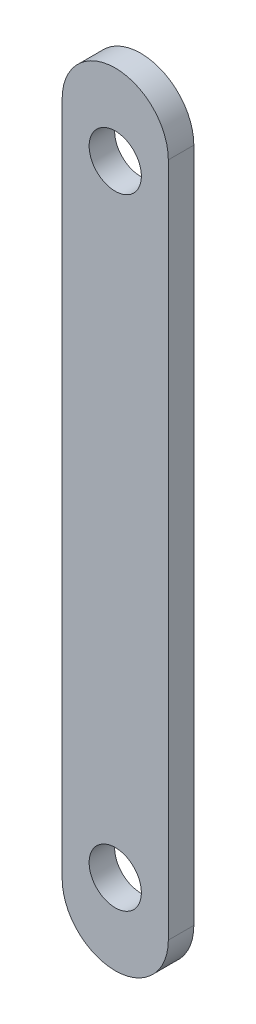
ISO-10303-21;
HEADER;
FILE_DESCRIPTION(('STEP AP214'),'2;1');
FILE_NAME('part.step','',(''),(''),'','','');
FILE_SCHEMA(('AUTOMOTIVE_DESIGN { 1 0 10303 214 1 1 1 1 }'));
ENDSEC;
DATA;
#1=APPLICATION_CONTEXT('core data for automotive mechanical design processes');
#2=APPLICATION_PROTOCOL_DEFINITION('international standard','automotive_design',2000,#1);
#3=PRODUCT_CONTEXT('',#1,'mechanical');
#4=PRODUCT('Part','Part','',(#3));
#5=PRODUCT_RELATED_PRODUCT_CATEGORY('part','',(#4));
#6=PRODUCT_DEFINITION_FORMATION('','',#4);
#7=PRODUCT_DEFINITION_CONTEXT('part definition',#1,'design');
#8=PRODUCT_DEFINITION('design','',#6,#7);
#9=PRODUCT_DEFINITION_SHAPE('','',#8);
#10=(LENGTH_UNIT() NAMED_UNIT(*) SI_UNIT(.MILLI.,.METRE.));
#11=(NAMED_UNIT(*) PLANE_ANGLE_UNIT() SI_UNIT($,.RADIAN.));
#12=(NAMED_UNIT(*) SI_UNIT($,.STERADIAN.) SOLID_ANGLE_UNIT());
#13=UNCERTAINTY_MEASURE_WITH_UNIT(LENGTH_MEASURE(1.E-05),#10,'distance_accuracy_value','');
#14=(GEOMETRIC_REPRESENTATION_CONTEXT(3) GLOBAL_UNCERTAINTY_ASSIGNED_CONTEXT((#13)) GLOBAL_UNIT_ASSIGNED_CONTEXT((#10,
#11,#12)) REPRESENTATION_CONTEXT('',''));
#15=CARTESIAN_POINT('',(0.,0.,0.));
#16=DIRECTION('',(0.,0.,1.));
#17=DIRECTION('',(1.,0.,0.));
#18=AXIS2_PLACEMENT_3D('',#15,#16,#17);
#19=CARTESIAN_POINT('',(0.,-49.,3.7));
#20=DIRECTION('',(0.,0.,1.));
#21=DIRECTION('',(1.,0.,0.));
#22=AXIS2_PLACEMENT_3D('',#19,#20,#21);
#23=PLANE('',#22);
#24=CARTESIAN_POINT('',(0.,-45.,3.7));
#25=DIRECTION('',(0.,0.,1.));
#26=DIRECTION('',(1.,0.,0.));
#27=AXIS2_PLACEMENT_3D('',#24,#25,#26);
#28=CIRCLE('',#27,3.78796992481205);
#29=CARTESIAN_POINT('',(3.78796992481205,-45.,3.7));
#30=VERTEX_POINT('',#29);
#31=EDGE_CURVE('E100',#30,#30,#28,.T.);
#32=ORIENTED_EDGE('',*,*,#31,.F.);
#33=EDGE_LOOP('',(#32));
#34=FACE_BOUND('',#33,.T.);
#35=CARTESIAN_POINT('',(0.,-49.,3.7));
#36=DIRECTION('',(0.,0.,1.));
#37=DIRECTION('',(1.,0.,0.));
#38=AXIS2_PLACEMENT_3D('',#35,#36,#37);
#39=CIRCLE('',#38,7.69774436090228);
#40=CARTESIAN_POINT('',(-7.69774436090228,-49.,3.7));
#41=VERTEX_POINT('',#40);
#42=CARTESIAN_POINT('',(7.69774436090228,-49.,3.7));
#43=VERTEX_POINT('',#42);
#44=EDGE_CURVE('E85',#41,#43,#39,.T.);
#45=ORIENTED_EDGE('',*,*,#44,.T.);
#46=DIRECTION('',(0.,1.,0.));
#47=VECTOR('',#46,1.);
#48=CARTESIAN_POINT('',(7.69774436090228,-49.,3.7));
#49=LINE('',#48,#47);
#50=CARTESIAN_POINT('',(7.69774436090228,49.,3.7));
#51=VERTEX_POINT('',#50);
#52=EDGE_CURVE('E80',#43,#51,#49,.T.);
#53=ORIENTED_EDGE('',*,*,#52,.T.);
#54=CARTESIAN_POINT('',(0.,49.,3.7));
#55=DIRECTION('',(0.,0.,1.));
#56=DIRECTION('',(1.,0.,0.));
#57=AXIS2_PLACEMENT_3D('',#54,#55,#56);
#58=CIRCLE('',#57,7.69774436090228);
#59=CARTESIAN_POINT('',(-7.69774436090228,49.,3.7));
#60=VERTEX_POINT('',#59);
#61=EDGE_CURVE('E83',#51,#60,#58,.T.);
#62=ORIENTED_EDGE('',*,*,#61,.T.);
#63=DIRECTION('',(0.,-1.,0.));
#64=VECTOR('',#63,1.);
#65=CARTESIAN_POINT('',(-7.69774436090228,-49.,3.7));
#66=LINE('',#65,#64);
#67=EDGE_CURVE('E50',#60,#41,#66,.T.);
#68=ORIENTED_EDGE('',*,*,#67,.T.);
#69=EDGE_LOOP('',(#45,#53,#62,#68));
#70=FACE_BOUND('',#69,.T.);
#71=CARTESIAN_POINT('',(0.,45.,3.7));
#72=DIRECTION('',(0.,0.,1.));
#73=DIRECTION('',(-1.,0.,0.));
#74=AXIS2_PLACEMENT_3D('',#71,#72,#73);
#75=CIRCLE('',#74,3.78796992481205);
#76=CARTESIAN_POINT('',(-3.78796992481205,45.,3.7));
#77=VERTEX_POINT('',#76);
#78=EDGE_CURVE('E115',#77,#77,#75,.T.);
#79=ORIENTED_EDGE('',*,*,#78,.F.);
#80=EDGE_LOOP('',(#79));
#81=FACE_BOUND('',#80,.T.);
#82=ADVANCED_FACE('F33',(#34,#70,#81),#23,.T.);
#83=CARTESIAN_POINT('',(0.,-49.,0.));
#84=DIRECTION('',(0.,0.,1.));
#85=DIRECTION('',(1.,0.,0.));
#86=AXIS2_PLACEMENT_3D('',#83,#84,#85);
#87=PLANE('',#86);
#88=CARTESIAN_POINT('',(0.,-49.,0.));
#89=DIRECTION('',(0.,0.,1.));
#90=DIRECTION('',(1.,0.,0.));
#91=AXIS2_PLACEMENT_3D('',#88,#89,#90);
#92=CIRCLE('',#91,7.69774436090228);
#93=CARTESIAN_POINT('',(-7.69774436090228,-49.,0.));
#94=VERTEX_POINT('',#93);
#95=CARTESIAN_POINT('',(7.69774436090228,-49.,0.));
#96=VERTEX_POINT('',#95);
#97=EDGE_CURVE('E97',#94,#96,#92,.T.);
#98=ORIENTED_EDGE('',*,*,#97,.F.);
#99=DIRECTION('',(0.,-1.,0.));
#100=VECTOR('',#99,1.);
#101=CARTESIAN_POINT('',(-7.69774436090228,-49.,0.));
#102=LINE('',#101,#100);
#103=CARTESIAN_POINT('',(-7.69774436090228,49.,0.));
#104=VERTEX_POINT('',#103);
#105=EDGE_CURVE('E73',#104,#94,#102,.T.);
#106=ORIENTED_EDGE('',*,*,#105,.F.);
#107=CARTESIAN_POINT('',(0.,49.,0.));
#108=DIRECTION('',(0.,0.,1.));
#109=DIRECTION('',(1.,0.,0.));
#110=AXIS2_PLACEMENT_3D('',#107,#108,#109);
#111=CIRCLE('',#110,7.69774436090228);
#112=CARTESIAN_POINT('',(7.69774436090228,49.,0.));
#113=VERTEX_POINT('',#112);
#114=EDGE_CURVE('E67',#113,#104,#111,.T.);
#115=ORIENTED_EDGE('',*,*,#114,.F.);
#116=DIRECTION('',(0.,1.,0.));
#117=VECTOR('',#116,1.);
#118=CARTESIAN_POINT('',(7.69774436090228,-49.,0.));
#119=LINE('',#118,#117);
#120=EDGE_CURVE('E89',#96,#113,#119,.T.);
#121=ORIENTED_EDGE('',*,*,#120,.F.);
#122=EDGE_LOOP('',(#98,#106,#115,#121));
#123=FACE_BOUND('',#122,.T.);
#124=CARTESIAN_POINT('',(0.,-45.,0.));
#125=DIRECTION('',(0.,0.,1.));
#126=DIRECTION('',(1.,0.,0.));
#127=AXIS2_PLACEMENT_3D('',#124,#125,#126);
#128=CIRCLE('',#127,3.78796992481205);
#129=CARTESIAN_POINT('',(3.78796992481205,-45.,0.));
#130=VERTEX_POINT('',#129);
#131=EDGE_CURVE('E112',#130,#130,#128,.T.);
#132=ORIENTED_EDGE('',*,*,#131,.T.);
#133=EDGE_LOOP('',(#132));
#134=FACE_BOUND('',#133,.T.);
#135=CARTESIAN_POINT('',(0.,45.,0.));
#136=DIRECTION('',(0.,0.,1.));
#137=DIRECTION('',(-1.,0.,0.));
#138=AXIS2_PLACEMENT_3D('',#135,#136,#137);
#139=CIRCLE('',#138,3.78796992481205);
#140=CARTESIAN_POINT('',(-3.78796992481205,45.,0.));
#141=VERTEX_POINT('',#140);
#142=EDGE_CURVE('E118',#141,#141,#139,.T.);
#143=ORIENTED_EDGE('',*,*,#142,.T.);
#144=EDGE_LOOP('',(#143));
#145=FACE_BOUND('',#144,.T.);
#146=ADVANCED_FACE('F108',(#123,#134,#145),#87,.F.);
#147=CARTESIAN_POINT('',(0.,-49.,3.7));
#148=DIRECTION('',(0.,0.,-1.));
#149=DIRECTION('',(-1.,0.,0.));
#150=AXIS2_PLACEMENT_3D('',#147,#148,#149);
#151=CYLINDRICAL_SURFACE('',#150,7.69774436090228);
#152=ORIENTED_EDGE('',*,*,#97,.T.);
#153=DIRECTION('',(0.,0.,-1.));
#154=VECTOR('',#153,1.);
#155=CARTESIAN_POINT('',(7.69774436090228,-49.,3.7));
#156=LINE('',#155,#154);
#157=EDGE_CURVE('E11',#43,#96,#156,.T.);
#158=ORIENTED_EDGE('',*,*,#157,.F.);
#159=ORIENTED_EDGE('',*,*,#44,.F.);
#160=DIRECTION('',(0.,0.,-1.));
#161=VECTOR('',#160,1.);
#162=CARTESIAN_POINT('',(-7.69774436090228,-49.,3.7));
#163=LINE('',#162,#161);
#164=EDGE_CURVE('E93',#41,#94,#163,.T.);
#165=ORIENTED_EDGE('',*,*,#164,.T.);
#166=EDGE_LOOP('',(#152,#158,#159,#165));
#167=FACE_BOUND('',#166,.T.);
#168=ADVANCED_FACE('F35',(#167),#151,.T.);
#169=CARTESIAN_POINT('',(7.69774436090228,-49.,3.7));
#170=DIRECTION('',(-1.,0.,0.));
#171=DIRECTION('',(0.,0.,1.));
#172=AXIS2_PLACEMENT_3D('',#169,#170,#171);
#173=PLANE('',#172);
#174=ORIENTED_EDGE('',*,*,#120,.T.);
#175=DIRECTION('',(0.,0.,-1.));
#176=VECTOR('',#175,1.);
#177=CARTESIAN_POINT('',(7.69774436090228,49.,3.7));
#178=LINE('',#177,#176);
#179=EDGE_CURVE('E42',#51,#113,#178,.T.);
#180=ORIENTED_EDGE('',*,*,#179,.F.);
#181=ORIENTED_EDGE('',*,*,#52,.F.);
#182=ORIENTED_EDGE('',*,*,#157,.T.);
#183=EDGE_LOOP('',(#174,#180,#181,#182));
#184=FACE_BOUND('',#183,.T.);
#185=ADVANCED_FACE('F88',(#184),#173,.F.);
#186=CARTESIAN_POINT('',(0.,49.,3.7));
#187=DIRECTION('',(0.,0.,-1.));
#188=DIRECTION('',(-1.,0.,0.));
#189=AXIS2_PLACEMENT_3D('',#186,#187,#188);
#190=CYLINDRICAL_SURFACE('',#189,7.69774436090228);
#191=ORIENTED_EDGE('',*,*,#114,.T.);
#192=DIRECTION('',(0.,0.,-1.));
#193=VECTOR('',#192,1.);
#194=CARTESIAN_POINT('',(-7.69774436090228,49.,3.7));
#195=LINE('',#194,#193);
#196=EDGE_CURVE('E90',#60,#104,#195,.T.);
#197=ORIENTED_EDGE('',*,*,#196,.F.);
#198=ORIENTED_EDGE('',*,*,#61,.F.);
#199=ORIENTED_EDGE('',*,*,#179,.T.);
#200=EDGE_LOOP('',(#191,#197,#198,#199));
#201=FACE_BOUND('',#200,.T.);
#202=ADVANCED_FACE('F91',(#201),#190,.T.);
#203=CARTESIAN_POINT('',(-7.69774436090228,-49.,3.7));
#204=DIRECTION('',(1.,0.,0.));
#205=DIRECTION('',(0.,0.,-1.));
#206=AXIS2_PLACEMENT_3D('',#203,#204,#205);
#207=PLANE('',#206);
#208=ORIENTED_EDGE('',*,*,#105,.T.);
#209=ORIENTED_EDGE('',*,*,#164,.F.);
#210=ORIENTED_EDGE('',*,*,#67,.F.);
#211=ORIENTED_EDGE('',*,*,#196,.T.);
#212=EDGE_LOOP('',(#208,#209,#210,#211));
#213=FACE_BOUND('',#212,.T.);
#214=ADVANCED_FACE('F105',(#213),#207,.F.);
#215=CARTESIAN_POINT('',(0.,-45.,3.7));
#216=DIRECTION('',(0.,0.,-1.));
#217=DIRECTION('',(-1.,0.,0.));
#218=AXIS2_PLACEMENT_3D('',#215,#216,#217);
#219=CYLINDRICAL_SURFACE('',#218,3.78796992481205);
#220=ORIENTED_EDGE('',*,*,#31,.T.);
#221=EDGE_LOOP('',(#220));
#222=FACE_BOUND('',#221,.T.);
#223=ORIENTED_EDGE('',*,*,#131,.F.);
#224=EDGE_LOOP('',(#223));
#225=FACE_BOUND('',#224,.T.);
#226=ADVANCED_FACE('F135',(#222,#225),#219,.F.);
#227=CARTESIAN_POINT('',(0.,45.,3.7));
#228=DIRECTION('',(0.,0.,-1.));
#229=DIRECTION('',(-1.,0.,0.));
#230=AXIS2_PLACEMENT_3D('',#227,#228,#229);
#231=CYLINDRICAL_SURFACE('',#230,3.78796992481205);
#232=ORIENTED_EDGE('',*,*,#78,.T.);
#233=EDGE_LOOP('',(#232));
#234=FACE_BOUND('',#233,.T.);
#235=ORIENTED_EDGE('',*,*,#142,.F.);
#236=EDGE_LOOP('',(#235));
#237=FACE_BOUND('',#236,.T.);
#238=ADVANCED_FACE('F124',(#234,#237),#231,.F.);
#239=CLOSED_SHELL('',(#82,#146,#168,#185,#202,#214,#226,#238));
#240=MANIFOLD_SOLID_BREP('B2',#239);
#241=ADVANCED_BREP_SHAPE_REPRESENTATION('',(#18,#240),#14);
#242=SHAPE_DEFINITION_REPRESENTATION(#9,#241);
ENDSEC;
END-ISO-10303-21;
